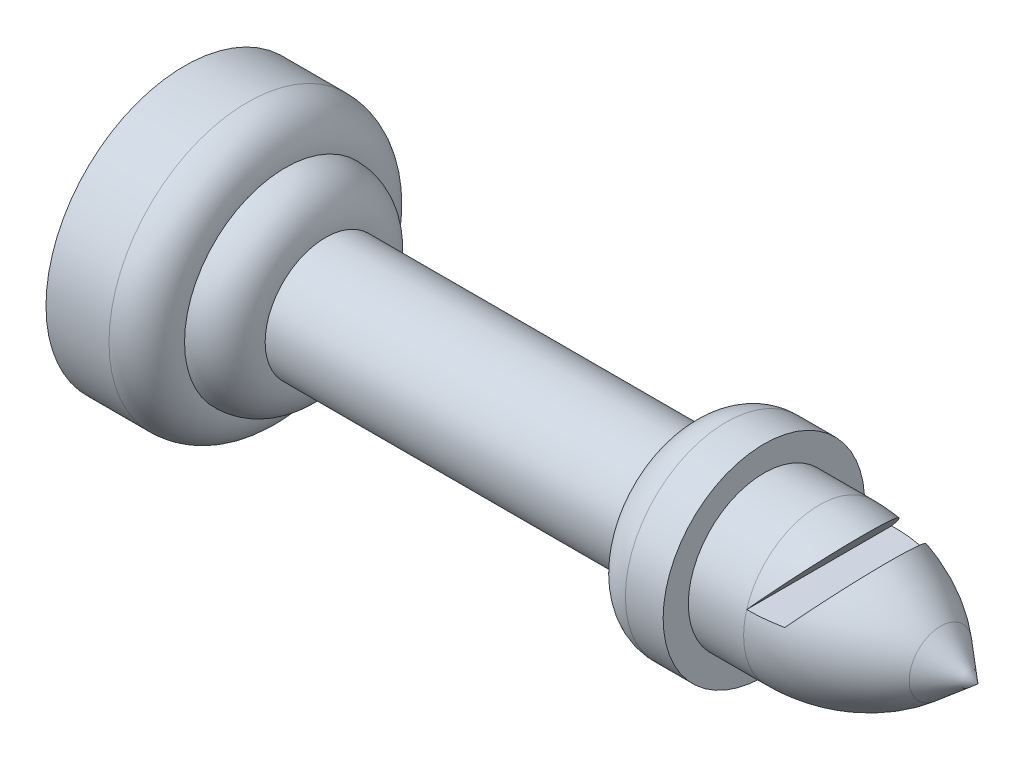
ISO-10303-21;
HEADER;
FILE_DESCRIPTION(('STEP AP214'),'2;1');
FILE_NAME('part.step','',(''),(''),'','','');
FILE_SCHEMA(('AUTOMOTIVE_DESIGN { 1 0 10303 214 1 1 1 1 }'));
ENDSEC;
DATA;
#1=APPLICATION_CONTEXT('core data for automotive mechanical design processes');
#2=APPLICATION_PROTOCOL_DEFINITION('international standard','automotive_design',2000,#1);
#3=PRODUCT_CONTEXT('',#1,'mechanical');
#4=PRODUCT('Part','Part','',(#3));
#5=PRODUCT_RELATED_PRODUCT_CATEGORY('part','',(#4));
#6=PRODUCT_DEFINITION_FORMATION('','',#4);
#7=PRODUCT_DEFINITION_CONTEXT('part definition',#1,'design');
#8=PRODUCT_DEFINITION('design','',#6,#7);
#9=PRODUCT_DEFINITION_SHAPE('','',#8);
#10=(LENGTH_UNIT() NAMED_UNIT(*) SI_UNIT(.MILLI.,.METRE.));
#11=(NAMED_UNIT(*) PLANE_ANGLE_UNIT() SI_UNIT($,.RADIAN.));
#12=(NAMED_UNIT(*) SI_UNIT($,.STERADIAN.) SOLID_ANGLE_UNIT());
#13=UNCERTAINTY_MEASURE_WITH_UNIT(LENGTH_MEASURE(1.E-05),#10,'distance_accuracy_value','');
#14=(GEOMETRIC_REPRESENTATION_CONTEXT(3) GLOBAL_UNCERTAINTY_ASSIGNED_CONTEXT((#13)) GLOBAL_UNIT_ASSIGNED_CONTEXT((#10,
#11,#12)) REPRESENTATION_CONTEXT('',''));
#15=CARTESIAN_POINT('',(0.,0.,0.));
#16=DIRECTION('',(0.,0.,1.));
#17=DIRECTION('',(1.,0.,0.));
#18=AXIS2_PLACEMENT_3D('',#15,#16,#17);
#19=CARTESIAN_POINT('',(50.3899249304417,11.,0.));
#20=DIRECTION('',(-1.,0.,0.));
#21=DIRECTION('',(0.,0.,1.));
#22=AXIS2_PLACEMENT_3D('',#19,#20,#21);
#23=DEGENERATE_TOROIDAL_SURFACE('',#22,9.,15.,.F.);
#24=CARTESIAN_POINT('',(53.0688261314124,12.6068600471893,-5.53012565333859));
#25=CARTESIAN_POINT('',(53.197779841996,12.7540278090024,-5.46299200753165));
#26=CARTESIAN_POINT('',(53.3249850413756,12.8992000913583,-5.38799546765509));
#27=CARTESIAN_POINT('',(53.5750162197194,13.1845468931976,-5.22234542775653));
#28=CARTESIAN_POINT('',(53.6978382569746,13.3247169142258,-5.13167824314576));
#29=CARTESIAN_POINT('',(53.9384835970365,13.5993521761921,-4.93447043976261));
#30=CARTESIAN_POINT('',(54.0562843289732,13.7337916582405,-4.82786623525727));
#31=CARTESIAN_POINT('',(54.2852664886689,13.9951163753426,-4.59926619979012));
#32=CARTESIAN_POINT('',(54.3964467343969,14.1220002614097,-4.47726763235293));
#33=CARTESIAN_POINT('',(54.592925325493,14.3462304473031,-4.24002993247073));
#34=CARTESIAN_POINT('',(54.67943490484,14.4449590617048,-4.12709544007215));
#35=CARTESIAN_POINT('',(54.8462579538327,14.6353450120429,-3.89115113941907));
#36=CARTESIAN_POINT('',(54.9265724676693,14.7270035396569,-3.76814303632989));
#37=CARTESIAN_POINT('',(55.0801538452916,14.902277500356,-3.51256620565445));
#38=CARTESIAN_POINT('',(55.1534269620934,14.9859000696639,-3.38000614710711));
#39=CARTESIAN_POINT('',(55.2921435928217,15.1442097140948,-3.10585419596471));
#40=CARTESIAN_POINT('',(55.3575911121459,15.2189013603574,-2.96426698115663));
#41=CARTESIAN_POINT('',(55.4804066468642,15.3590639603987,-2.67141695851159));
#42=CARTESIAN_POINT('',(55.5376963650972,15.4244455579432,-2.52007832322703));
#43=CARTESIAN_POINT('',(55.642600642106,15.5441670268496,-2.20995067487123));
#44=CARTESIAN_POINT('',(55.6902204524076,15.5985128914885,-2.05116576370601));
#45=CARTESIAN_POINT('',(55.7749577509117,15.6952188994544,-1.72753410959527));
#46=CARTESIAN_POINT('',(55.8120913186326,15.7375973934495,-1.56269709038728));
#47=CARTESIAN_POINT('',(55.8752475291283,15.8096740952458,-1.22827483179028));
#48=CARTESIAN_POINT('',(55.9012762843317,15.8393792788246,-1.05869225942007));
#49=CARTESIAN_POINT('',(55.9417136985954,15.8855282707672,-0.716511047153845));
#50=CARTESIAN_POINT('',(55.9561324797353,15.9019836309025,-0.543915168834099));
#51=CARTESIAN_POINT('',(55.9730822021221,15.9213274147745,-0.197383085149083));
#52=CARTESIAN_POINT('',(55.9756139523859,15.9242167617976,-0.023446971805672));
#53=CARTESIAN_POINT('',(55.9691595198293,15.9168506736964,0.302765420454932));
#54=CARTESIAN_POINT('',(55.9615343520461,15.9081484900135,0.455107643948066));
#55=CARTESIAN_POINT('',(55.9371955240737,15.8803719272326,0.758168934683142));
#56=CARTESIAN_POINT('',(55.9204786055681,15.8612938295979,0.908887400239774));
#57=CARTESIAN_POINT('',(55.8781973830614,15.8130406009403,1.20760109726925));
#58=CARTESIAN_POINT('',(55.8526234948177,15.7838545319497,1.3555931950426));
#59=CARTESIAN_POINT('',(55.7930088043809,15.715819571784,1.64765271280331));
#60=CARTESIAN_POINT('',(55.758964640074,15.6769668436139,1.79171854908133));
#61=CARTESIAN_POINT('',(55.6851475719756,15.5927234926744,2.06651225599645));
#62=CARTESIAN_POINT('',(55.6458334673826,15.5478564721408,2.19752470355436));
#63=CARTESIAN_POINT('',(55.5605892094678,15.4505718993437,2.45451466199021));
#64=CARTESIAN_POINT('',(55.5146568852803,15.3981518695907,2.58049050340438));
#65=CARTESIAN_POINT('',(55.3677149912479,15.2304551855367,2.94975688510388));
#66=CARTESIAN_POINT('',(55.2574668912873,15.104635106053,3.18472915253418));
#67=CARTESIAN_POINT('',(55.0030639760674,14.8142990818922,3.65312990503934));
#68=CARTESIAN_POINT('',(54.8565109101178,14.6470461458965,3.88353148567212));
#69=CARTESIAN_POINT('',(54.5428242895247,14.2890528965788,4.30990137590636));
#70=CARTESIAN_POINT('',(54.3756630686379,14.0982810092984,4.50582252071206));
#71=CARTESIAN_POINT('',(54.0249726320784,13.6980573445109,4.86183244871354));
#72=CARTESIAN_POINT('',(53.8413999991939,13.4885560173333,5.02182200090159));
#73=CARTESIAN_POINT('',(53.4628231097641,13.0565070810181,5.30410564780449));
#74=CARTESIAN_POINT('',(53.2678601523645,12.8340066043191,5.42652695079986));
#75=CARTESIAN_POINT('',(53.0688261314124,12.6068600471893,5.53012565333859));
#76=B_SPLINE_CURVE_WITH_KNOTS('',3,(#24,#25,#26,#27,#28,#29,#30,#31,#32,#33,#34,#35,#36,#37,#38,
#39,#40,#41,#42,#43,#44,#45,#46,#47,#48,#49,#50,#51,#52,#53,#54,#55,#56,#57,#58,#59,#60,#61,#62,
#63,#64,#65,#66,#67,#68,#69,#70,#71,#72,#73,#74,#75),.UNSPECIFIED.,.F.,.F.,(4,2,2,2,2,2,2,2,2,2,
2,2,2,2,2,2,2,2,2,2,2,2,2,2,2,4),(0.,0.620502170800822,1.24154896630845,1.86514323455668,
2.48884850841412,3.00782711146784,3.52671804760373,4.04514384703762,4.56330315285486,
5.08614158216545,5.60869530491601,6.13044334235936,6.65190382204348,7.1729091760678,
7.69387907057977,8.15160079284239,8.60948666235488,9.06786957235137,9.52643471974564,
9.95783658896935,10.3893802873669,11.2513660736983,12.2083954832962,13.1667239796494,
14.1276673748359,15.0853201134679),.UNSPECIFIED.);
#77=CARTESIAN_POINT('',(53.1404754237636,12.6886294351589,-5.49191523058684));
#78=VERTEX_POINT('',#77);
#79=CARTESIAN_POINT('',(53.1404754237636,12.6886294351589,5.49191523058684));
#80=VERTEX_POINT('',#79);
#81=EDGE_CURVE('E100',#78,#80,#76,.T.);
#82=ORIENTED_EDGE('',*,*,#81,.T.);
#83=CARTESIAN_POINT('',(59.7410941995924,12.6886294351589,2.14307238397965));
#84=CARTESIAN_POINT('',(59.6918956159423,12.6886294351589,2.19300718822318));
#85=CARTESIAN_POINT('',(59.6420500558606,12.6886294351589,2.24229743952765));
#86=CARTESIAN_POINT('',(59.5411742713549,12.6886294351589,2.339642584806));
#87=CARTESIAN_POINT('',(59.4901441458257,12.6886294351589,2.38769758120562));
#88=CARTESIAN_POINT('',(59.3354706448059,12.6886294351589,2.53006368376872));
#89=CARTESIAN_POINT('',(59.2302036508667,12.6886294351589,2.62261673280479));
#90=CARTESIAN_POINT('',(59.0161205373442,12.6886294351589,2.80318907820046));
#91=CARTESIAN_POINT('',(58.9073096634447,12.6886294351589,2.8912146188333));
#92=CARTESIAN_POINT('',(58.6864161832837,12.6886294351589,3.06307237778934));
#93=CARTESIAN_POINT('',(58.5743331989777,12.6886294351589,3.14690410851863));
#94=CARTESIAN_POINT('',(58.2341864979827,12.6886294351589,3.39194233869002));
#95=CARTESIAN_POINT('',(58.0017323792394,12.6886294351589,3.54710323608377));
#96=CARTESIAN_POINT('',(57.5270020897726,12.6886294351589,3.84178596942499));
#97=CARTESIAN_POINT('',(57.2847201067934,12.6886294351589,3.98129836158695));
#98=CARTESIAN_POINT('',(56.6955363197894,12.6886294351589,4.29621202569859));
#99=CARTESIAN_POINT('',(56.3447267491199,12.6886294351589,4.46435307865889));
#100=CARTESIAN_POINT('',(55.630192973998,12.6886294351589,4.77036814928859));
#101=CARTESIAN_POINT('',(55.2664680703092,12.6886294351589,4.90824052529983));
#102=CARTESIAN_POINT('',(54.528078907649,12.6886294351589,5.15364615028319));
#103=CARTESIAN_POINT('',(54.1533933211201,12.6886294351589,5.26111521393694));
#104=CARTESIAN_POINT('',(53.3964866800814,12.6886294351589,5.44496361432838));
#105=CARTESIAN_POINT('',(53.0142657012473,12.6886294351589,5.52134326312161));
#106=CARTESIAN_POINT('',(52.2421790096399,12.6886294351589,5.64314747747477));
#107=CARTESIAN_POINT('',(51.8522784982744,12.6886294351589,5.68835141522395));
#108=CARTESIAN_POINT('',(51.0700871782298,12.6886294351589,5.74674778950862));
#109=CARTESIAN_POINT('',(50.6777963528164,12.6886294351589,5.75994000167581));
#110=CARTESIAN_POINT('',(49.8939111517407,12.6886294351589,5.75425965018309));
#111=CARTESIAN_POINT('',(49.5023165003827,12.6886294351589,5.73542488911303));
#112=CARTESIAN_POINT('',(48.7219731847928,12.6886294351589,5.6658426745292));
#113=CARTESIAN_POINT('',(48.3332244604778,12.6886294351589,5.61509589671876));
#114=CARTESIAN_POINT('',(47.5854895221479,12.6886294351589,5.4860938624354));
#115=CARTESIAN_POINT('',(47.226169202273,12.6886294351589,5.40976949911571));
#116=CARTESIAN_POINT('',(46.5145183265015,12.6886294351589,5.22954742598611));
#117=CARTESIAN_POINT('',(46.162187637063,12.6886294351589,5.12565024352118));
#118=CARTESIAN_POINT('',(45.4661237116663,12.6886294351589,4.89037024235336));
#119=CARTESIAN_POINT('',(45.1224055124068,12.6886294351589,4.75894265658034));
#120=CARTESIAN_POINT('',(44.6155804697985,12.6886294351589,4.54151080186105));
#121=CARTESIAN_POINT('',(44.448068132847,12.6886294351589,4.46563628527528));
#122=CARTESIAN_POINT('',(44.1162185610138,12.6886294351589,4.30710499560139));
#123=CARTESIAN_POINT('',(43.9518823694679,12.6886294351589,4.22444603914182));
#124=CARTESIAN_POINT('',(43.7893061546129,12.6886294351589,4.1384080791379));
#125=B_SPLINE_CURVE_WITH_KNOTS('',3,(#83,#84,#85,#86,#87,#88,#89,#90,#91,#92,#93,#94,#95,#96,
#97,#98,#99,#100,#101,#102,#103,#104,#105,#106,#107,#108,#109,#110,#111,#112,#113,#114,#115,
#116,#117,#118,#119,#120,#121,#122,#123,#124),.UNSPECIFIED.,.F.,.F.,(4,2,2,2,2,2,2,2,2,2,2,2,2,
2,2,2,2,2,2,2,4),(0.,0.21028507697573,0.420552660767613,0.840915486506825,1.26068208909176,
1.68049738301398,2.5182071102555,3.35641970104828,4.52196058312432,5.68756466410649,
6.85561142917855,8.02364646985966,9.19986503670883,10.376091847581,11.5509312791007,
12.7257458354713,13.8266702831026,14.9275736764796,16.0302813375091,16.581833772903,
17.1335644103998),.UNSPECIFIED.);
#126=CARTESIAN_POINT('',(50.3899249304417,12.6886294351589,5.75747606427635));
#127=VERTEX_POINT('',#126);
#128=EDGE_CURVE('E88',#80,#127,#125,.T.);
#129=ORIENTED_EDGE('',*,*,#128,.T.);
#130=CARTESIAN_POINT('',(50.3899249304417,11.,0.));
#131=DIRECTION('',(-1.,0.,0.));
#132=DIRECTION('',(0.,0.,1.));
#133=AXIS2_PLACEMENT_3D('',#130,#131,#132);
#134=CIRCLE('',#133,6.);
#135=CARTESIAN_POINT('',(50.3899249304417,12.6886294351589,-5.75747606427635));
#136=VERTEX_POINT('',#135);
#137=EDGE_CURVE('E103',#136,#127,#134,.T.);
#138=ORIENTED_EDGE('',*,*,#137,.F.);
#139=CARTESIAN_POINT('',(59.7410941995924,12.6886294351589,-2.14307238397961));
#140=CARTESIAN_POINT('',(59.6918956159424,12.6886294351589,-2.19300718822314));
#141=CARTESIAN_POINT('',(59.6420500558606,12.6886294351589,-2.24229743952761));
#142=CARTESIAN_POINT('',(59.541174271355,12.6886294351589,-2.33964258480596));
#143=CARTESIAN_POINT('',(59.4901441458257,12.6886294351589,-2.38769758120558));
#144=CARTESIAN_POINT('',(59.335470644806,12.6886294351589,-2.53006368376867));
#145=CARTESIAN_POINT('',(59.2302036508668,12.6886294351589,-2.62261673280475));
#146=CARTESIAN_POINT('',(59.0161205373442,12.6886294351589,-2.80318907820041));
#147=CARTESIAN_POINT('',(58.9073096634448,12.6886294351589,-2.89121461883326));
#148=CARTESIAN_POINT('',(58.6864161832838,12.6886294351589,-3.06307237778929));
#149=CARTESIAN_POINT('',(58.5743331989777,12.6886294351589,-3.14690410851858));
#150=CARTESIAN_POINT('',(58.2341864979828,12.6886294351589,-3.39194233868997));
#151=CARTESIAN_POINT('',(58.0017323792395,12.6886294351589,-3.54710323608372));
#152=CARTESIAN_POINT('',(57.5270020897727,12.6886294351589,-3.84178596942494));
#153=CARTESIAN_POINT('',(57.2847201067935,12.6886294351589,-3.9812983615869));
#154=CARTESIAN_POINT('',(56.6955363197895,12.6886294351589,-4.29621202569855));
#155=CARTESIAN_POINT('',(56.34472674912,12.6886294351589,-4.46435307865885));
#156=CARTESIAN_POINT('',(55.6301929739981,12.6886294351589,-4.77036814928855));
#157=CARTESIAN_POINT('',(55.2664680703093,12.6886294351589,-4.90824052529979));
#158=CARTESIAN_POINT('',(54.5280789076491,12.6886294351589,-5.15364615028315));
#159=CARTESIAN_POINT('',(54.1533933211202,12.6886294351589,-5.26111521393691));
#160=CARTESIAN_POINT('',(53.3964866800815,12.6886294351589,-5.44496361432835));
#161=CARTESIAN_POINT('',(53.0142657012474,12.6886294351589,-5.52134326312159));
#162=CARTESIAN_POINT('',(52.24217900964,12.6886294351589,-5.64314747747476));
#163=CARTESIAN_POINT('',(51.8522784982745,12.6886294351589,-5.68835141522394));
#164=CARTESIAN_POINT('',(51.0700871782299,12.6886294351589,-5.74674778950861));
#165=CARTESIAN_POINT('',(50.6777963528165,12.6886294351589,-5.75994000167581));
#166=CARTESIAN_POINT('',(49.8939111517408,12.6886294351589,-5.7542596501831));
#167=CARTESIAN_POINT('',(49.5023165003828,12.6886294351589,-5.73542488911303));
#168=CARTESIAN_POINT('',(48.721973184793,12.6886294351589,-5.66584267452921));
#169=CARTESIAN_POINT('',(48.333224460478,12.6886294351589,-5.61509589671878));
#170=CARTESIAN_POINT('',(47.585489522148,12.6886294351589,-5.48609386243543));
#171=CARTESIAN_POINT('',(47.2261692022731,12.6886294351589,-5.40976949911573));
#172=CARTESIAN_POINT('',(46.5145183265016,12.6886294351589,-5.22954742598613));
#173=CARTESIAN_POINT('',(46.162187637063,12.6886294351589,-5.1256502435212));
#174=CARTESIAN_POINT('',(45.4661237116664,12.6886294351589,-4.89037024235338));
#175=CARTESIAN_POINT('',(45.1224055124068,12.6886294351589,-4.75894265658037));
#176=CARTESIAN_POINT('',(44.6155804697985,12.6886294351589,-4.54151080186107));
#177=CARTESIAN_POINT('',(44.4480681328471,12.6886294351589,-4.46563628527529));
#178=CARTESIAN_POINT('',(44.1162185610138,12.6886294351589,-4.3071049956014));
#179=CARTESIAN_POINT('',(43.9518823694679,12.6886294351589,-4.22444603914182));
#180=CARTESIAN_POINT('',(43.7893061546129,12.6886294351589,-4.13840807913791));
#181=B_SPLINE_CURVE_WITH_KNOTS('',3,(#139,#140,#141,#142,#143,#144,#145,#146,#147,#148,#149,
#150,#151,#152,#153,#154,#155,#156,#157,#158,#159,#160,#161,#162,#163,#164,#165,#166,#167,#168,
#169,#170,#171,#172,#173,#174,#175,#176,#177,#178,#179,#180),.UNSPECIFIED.,.F.,.F.,(4,2,2,2,2,2,
2,2,2,2,2,2,2,2,2,2,2,2,2,2,4),(0.,0.210285076975723,0.420552660767611,0.84091548650681,
1.26068208909175,1.68049738301396,2.51820711025547,3.35641970104824,4.52196058312427,
5.68756466410644,6.85561142917849,8.02364646985961,9.19986503670877,10.3760918475809,
11.5509312791007,12.7257458354712,13.8266702831025,14.9275736764796,16.0302813375091,
16.581833772903,17.1335644103999),.UNSPECIFIED.);
#182=EDGE_CURVE('E11',#78,#136,#181,.T.);
#183=ORIENTED_EDGE('',*,*,#182,.F.);
#184=EDGE_LOOP('',(#82,#129,#138,#183));
#185=FACE_BOUND('',#184,.T.);
#186=CARTESIAN_POINT('',(60.0317390757398,11.,0.));
#187=DIRECTION('',(-1.,0.,0.));
#188=DIRECTION('',(0.,0.,1.));
#189=AXIS2_PLACEMENT_3D('',#186,#187,#188);
#190=CIRCLE('',#189,2.49066664678466);
#191=CARTESIAN_POINT('',(60.0317390757398,11.,2.49066664678466));
#192=VERTEX_POINT('',#191);
#193=EDGE_CURVE('E110',#192,#192,#190,.T.);
#194=ORIENTED_EDGE('',*,*,#193,.T.);
#195=EDGE_LOOP('',(#194));
#196=FACE_BOUND('',#195,.T.);
#197=ADVANCED_FACE('F47',(#185,#196),#23,.F.);
#198=CARTESIAN_POINT('',(43.,11.,0.));
#199=DIRECTION('',(-1.,0.,0.));
#200=DIRECTION('',(0.,0.,1.));
#201=AXIS2_PLACEMENT_3D('',#198,#199,#200);
#202=TOROIDAL_SURFACE('',#201,4.8,3.2);
#203=CARTESIAN_POINT('',(39.8,11.,0.));
#204=DIRECTION('',(-1.,0.,0.));
#205=DIRECTION('',(0.,0.,1.));
#206=AXIS2_PLACEMENT_3D('',#203,#204,#205);
#207=CIRCLE('',#206,4.8);
#208=CARTESIAN_POINT('',(39.8,11.,4.8));
#209=VERTEX_POINT('',#208);
#210=EDGE_CURVE('E93',#209,#209,#207,.T.);
#211=ORIENTED_EDGE('',*,*,#210,.F.);
#212=EDGE_LOOP('',(#211));
#213=FACE_BOUND('',#212,.T.);
#214=CARTESIAN_POINT('',(43.,11.,0.));
#215=DIRECTION('',(-1.,0.,0.));
#216=DIRECTION('',(0.,0.,1.));
#217=AXIS2_PLACEMENT_3D('',#214,#215,#216);
#218=CIRCLE('',#217,8.);
#219=CARTESIAN_POINT('',(43.,11.,8.));
#220=VERTEX_POINT('',#219);
#221=EDGE_CURVE('E126',#220,#220,#218,.T.);
#222=ORIENTED_EDGE('',*,*,#221,.T.);
#223=EDGE_LOOP('',(#222));
#224=FACE_BOUND('',#223,.T.);
#225=ADVANCED_FACE('F49',(#213,#224),#202,.T.);
#226=CARTESIAN_POINT('',(0.,11.,0.));
#227=DIRECTION('',(-1.,0.,0.));
#228=DIRECTION('',(0.,0.,1.));
#229=AXIS2_PLACEMENT_3D('',#226,#227,#228);
#230=CYLINDRICAL_SURFACE('',#229,8.);
#231=CARTESIAN_POINT('',(46.,11.,0.));
#232=DIRECTION('',(-1.,0.,0.));
#233=DIRECTION('',(0.,0.,1.));
#234=AXIS2_PLACEMENT_3D('',#231,#232,#233);
#235=CIRCLE('',#234,8.);
#236=CARTESIAN_POINT('',(46.,11.,8.));
#237=VERTEX_POINT('',#236);
#238=EDGE_CURVE('E118',#237,#237,#235,.T.);
#239=ORIENTED_EDGE('',*,*,#238,.T.);
#240=EDGE_LOOP('',(#239));
#241=FACE_BOUND('',#240,.T.);
#242=ORIENTED_EDGE('',*,*,#221,.F.);
#243=EDGE_LOOP('',(#242));
#244=FACE_BOUND('',#243,.T.);
#245=ADVANCED_FACE('F185',(#241,#244),#230,.T.);
#246=CARTESIAN_POINT('',(46.,0.,0.));
#247=DIRECTION('',(1.,0.,0.));
#248=DIRECTION('',(0.,0.,-1.));
#249=AXIS2_PLACEMENT_3D('',#246,#247,#248);
#250=PLANE('',#249);
#251=CARTESIAN_POINT('',(46.,11.,0.));
#252=DIRECTION('',(-1.,0.,0.));
#253=DIRECTION('',(0.,0.,1.));
#254=AXIS2_PLACEMENT_3D('',#251,#252,#253);
#255=CIRCLE('',#254,6.);
#256=CARTESIAN_POINT('',(46.,11.,6.));
#257=VERTEX_POINT('',#256);
#258=EDGE_CURVE('E115',#257,#257,#255,.T.);
#259=ORIENTED_EDGE('',*,*,#258,.T.);
#260=EDGE_LOOP('',(#259));
#261=FACE_BOUND('',#260,.T.);
#262=ORIENTED_EDGE('',*,*,#238,.F.);
#263=EDGE_LOOP('',(#262));
#264=FACE_BOUND('',#263,.T.);
#265=ADVANCED_FACE('F190',(#261,#264),#250,.T.);
#266=CARTESIAN_POINT('',(0.,11.,0.));
#267=DIRECTION('',(-1.,0.,0.));
#268=DIRECTION('',(0.,0.,1.));
#269=AXIS2_PLACEMENT_3D('',#266,#267,#268);
#270=CYLINDRICAL_SURFACE('',#269,6.);
#271=ORIENTED_EDGE('',*,*,#137,.T.);
#272=EDGE_CURVE('E71',#127,#136,#134,.T.);
#273=ORIENTED_EDGE('',*,*,#272,.T.);
#274=EDGE_LOOP('',(#271,#273));
#275=FACE_BOUND('',#274,.T.);
#276=ORIENTED_EDGE('',*,*,#258,.F.);
#277=EDGE_LOOP('',(#276));
#278=FACE_BOUND('',#277,.T.);
#279=ADVANCED_FACE('F112',(#275,#278),#270,.T.);
#280=ORIENTED_EDGE('',*,*,#272,.F.);
#281=CARTESIAN_POINT('',(50.2953052163719,12.5806451710378,5.78774392493274));
#282=CARTESIAN_POINT('',(50.4293472695136,12.7336199777372,5.74684613759314));
#283=CARTESIAN_POINT('',(50.5623423347454,12.8853999148461,5.69789932720466));
#284=CARTESIAN_POINT('',(50.8253735390157,13.1855829296991,5.5839144012936));
#285=CARTESIAN_POINT('',(50.9554081262384,13.3339842364411,5.51886804958245));
#286=CARTESIAN_POINT('',(51.2123681799172,13.6272385817728,5.37224542978904));
#287=CARTESIAN_POINT('',(51.3392671239511,13.7720613517838,5.29056180265103));
#288=CARTESIAN_POINT('',(51.5879983019549,14.0559245348925,5.11105231870086));
#289=CARTESIAN_POINT('',(51.7098311186785,14.194965613055,5.0132283249729));
#290=CARTESIAN_POINT('',(51.9477830443599,14.4665270296529,4.80121963770974));
#291=CARTESIAN_POINT('',(52.063878913582,14.599020845859,4.68697473135996));
#292=CARTESIAN_POINT('',(52.2885836526614,14.8554639785882,4.44278852240863));
#293=CARTESIAN_POINT('',(52.3971968297854,14.9794182107573,4.31285637046289));
#294=CARTESIAN_POINT('',(52.6055259818934,15.217172788717,4.03797388853093));
#295=CARTESIAN_POINT('',(52.705256832148,15.3309901108341,3.89304958084606));
#296=CARTESIAN_POINT('',(52.8946315974361,15.5471130919037,3.58874935345403));
#297=CARTESIAN_POINT('',(52.9842776641231,15.64942120642,3.42937652958515));
#298=CARTESIAN_POINT('',(53.1422606274735,15.8297184542902,3.11661652583141));
#299=CARTESIAN_POINT('',(53.2118634151469,15.9091522792766,2.96470056123582));
#300=CARTESIAN_POINT('',(53.3410804856353,16.0566205992323,2.65139836397));
#301=CARTESIAN_POINT('',(53.4006970347046,16.1246576805527,2.49001429122617));
#302=CARTESIAN_POINT('',(53.5088820787725,16.248123308064,2.15932133029911));
#303=CARTESIAN_POINT('',(53.5574727757029,16.3035771920959,1.99002921046404));
#304=CARTESIAN_POINT('',(53.6428670718682,16.4010329952781,1.64482160331609));
#305=CARTESIAN_POINT('',(53.6796771746811,16.4430423366036,1.46890983059665));
#306=CARTESIAN_POINT('',(53.7421704713818,16.514362491426,1.10431071341794));
#307=CARTESIAN_POINT('',(53.7672943109464,16.5430349446664,0.91540152954809));
#308=CARTESIAN_POINT('',(53.8033725011515,16.5842089944763,0.534488717041966));
#309=CARTESIAN_POINT('',(53.8143287507273,16.5967127581963,0.342485506603259));
#310=CARTESIAN_POINT('',(53.8209265774012,16.6042424940994,0.00412333402962834));
#311=CARTESIAN_POINT('',(53.8196157492569,16.6027465181926,-0.142116251629624));
#312=CARTESIAN_POINT('',(53.8087012076435,16.5902903534712,-0.433927137241937));
#313=CARTESIAN_POINT('',(53.7990955264028,16.5793279189474,-0.579498270380868));
#314=CARTESIAN_POINT('',(53.7717066694889,16.5480705262567,-0.868961990693927));
#315=CARTESIAN_POINT('',(53.753917435284,16.5277686538216,-1.01285325314135));
#316=CARTESIAN_POINT('',(53.7103883159957,16.4780912693527,-1.29789092597789));
#317=CARTESIAN_POINT('',(53.6846453965211,16.4487122943355,-1.43903626689447));
#318=CARTESIAN_POINT('',(53.6256353815399,16.3813674169369,-1.71711412968049));
#319=CARTESIAN_POINT('',(53.5923948447632,16.3434318245701,-1.8540596291761));
#320=CARTESIAN_POINT('',(53.51873364844,16.2593663614957,-2.12344870996809));
#321=CARTESIAN_POINT('',(53.4783103784152,16.2132335115934,-2.2558906335742));
#322=CARTESIAN_POINT('',(53.3469431700033,16.0633113577435,-2.64522755171428));
#323=CARTESIAN_POINT('',(53.2458443029104,15.9479327934157,-2.89440029892156));
#324=CARTESIAN_POINT('',(53.0129457182834,15.6821384764172,-3.3831254511046));
#325=CARTESIAN_POINT('',(52.8795326178639,15.529881458791,-3.62088885378019));
#326=CARTESIAN_POINT('',(52.5910785499835,15.2006847310372,-4.06400603981809));
#327=CARTESIAN_POINT('',(52.4360265136894,15.0237323886604,-4.26934312103058));
#328=CARTESIAN_POINT('',(52.0870532718654,14.6254684635707,-4.67042297585278));
#329=CARTESIAN_POINT('',(51.8907040467309,14.4013859159186,-4.86128917962414));
#330=CARTESIAN_POINT('',(51.4817032028632,13.9346157974066,-5.19724443344277));
#331=CARTESIAN_POINT('',(51.2690492570352,13.6919255707618,-5.34232693382761));
#332=CARTESIAN_POINT('',(50.9278142727489,13.3024928924583,-5.53293806177691));
#333=CARTESIAN_POINT('',(50.8029593937462,13.1600029011963,-5.59430392027455));
#334=CARTESIAN_POINT('',(50.550833712185,12.8722657582863,-5.70211425567124));
#335=CARTESIAN_POINT('',(50.4235701204618,12.7270268359674,-5.74859751973325));
#336=CARTESIAN_POINT('',(50.2953052163719,12.5806451710378,-5.78774392493274));
#337=B_SPLINE_CURVE_WITH_KNOTS('',3,(#281,#282,#283,#284,#285,#286,#287,#288,#289,#290,#291,
#292,#293,#294,#295,#296,#297,#298,#299,#300,#301,#302,#303,#304,#305,#306,#307,#308,#309,#310,
#311,#312,#313,#314,#315,#316,#317,#318,#319,#320,#321,#322,#323,#324,#325,#326,#327,#328,#329,
#330,#331,#332,#333,#334,#335,#336),.UNSPECIFIED.,.F.,.F.,(4,2,2,2,2,2,2,2,2,2,2,2,2,2,2,2,2,2,
2,2,2,2,2,2,2,2,2,4),(0.,0.622273547287704,1.24486609708476,1.87161127376612,2.49828415573491,
3.1273165195405,3.75598371418263,4.38357746211704,5.011037053899,5.56528700987792,
6.11941101472516,6.6724091193832,7.22510140795637,7.80205466405445,8.37893058091535,
8.81717531450056,9.25552404058526,9.69419781303966,10.133039149943,10.5703497392217,
11.0078195900792,11.8819272706043,12.8151247819503,13.7488014078065,14.8061956557647,
15.8637411024816,16.460642817982,17.0559759743814),.UNSPECIFIED.);
#338=EDGE_CURVE('E62',#127,#136,#337,.T.);
#339=ORIENTED_EDGE('',*,*,#338,.T.);
#340=EDGE_LOOP('',(#280,#339));
#341=FACE_BOUND('',#340,.T.);
#342=ADVANCED_FACE('F108',(#341),#23,.F.);
#343=CARTESIAN_POINT('',(60.0317390757398,11.,0.));
#344=DIRECTION('',(-1.,0.,0.));
#345=DIRECTION('',(0.,0.,1.));
#346=AXIS2_PLACEMENT_3D('',#343,#344,#345);
#347=CONICAL_SURFACE('',#346,2.49066664678466,0.698131700797734);
#348=CARTESIAN_POINT('',(63.,11.,0.));
#349=VERTEX_POINT('',#348);
#350=VERTEX_LOOP('',#349);
#351=FACE_BOUND('',#350,.T.);
#352=ORIENTED_EDGE('',*,*,#193,.F.);
#353=EDGE_LOOP('',(#352));
#354=FACE_BOUND('',#353,.T.);
#355=ADVANCED_FACE('F172',(#351,#354),#347,.T.);
#356=CARTESIAN_POINT('',(0.,0.,0.));
#357=DIRECTION('',(1.,0.,0.));
#358=DIRECTION('',(0.,0.,-1.));
#359=AXIS2_PLACEMENT_3D('',#356,#357,#358);
#360=PLANE('',#359);
#361=CARTESIAN_POINT('',(0.,11.,0.));
#362=DIRECTION('',(-1.,0.,0.));
#363=DIRECTION('',(0.,0.,1.));
#364=AXIS2_PLACEMENT_3D('',#361,#362,#363);
#365=CIRCLE('',#364,10.);
#366=CARTESIAN_POINT('',(0.,11.,10.));
#367=VERTEX_POINT('',#366);
#368=EDGE_CURVE('E231',#367,#367,#365,.T.);
#369=ORIENTED_EDGE('',*,*,#368,.F.);
#370=EDGE_LOOP('',(#369));
#371=FACE_BOUND('',#370,.T.);
#372=CARTESIAN_POINT('',(0.,11.,0.));
#373=DIRECTION('',(-1.,0.,0.));
#374=DIRECTION('',(0.,0.,1.));
#375=AXIS2_PLACEMENT_3D('',#372,#373,#374);
#376=CIRCLE('',#375,11.);
#377=CARTESIAN_POINT('',(0.,11.,11.));
#378=VERTEX_POINT('',#377);
#379=EDGE_CURVE('E212',#378,#378,#376,.T.);
#380=ORIENTED_EDGE('',*,*,#379,.T.);
#381=EDGE_LOOP('',(#380));
#382=FACE_BOUND('',#381,.T.);
#383=ADVANCED_FACE('F169',(#371,#382),#360,.F.);
#384=CARTESIAN_POINT('',(0.,11.,0.));
#385=DIRECTION('',(-1.,0.,0.));
#386=DIRECTION('',(0.,0.,1.));
#387=AXIS2_PLACEMENT_3D('',#384,#385,#386);
#388=CYLINDRICAL_SURFACE('',#387,11.);
#389=CARTESIAN_POINT('',(5.,11.,0.));
#390=DIRECTION('',(-1.,0.,0.));
#391=DIRECTION('',(0.,0.,1.));
#392=AXIS2_PLACEMENT_3D('',#389,#390,#391);
#393=CIRCLE('',#392,11.);
#394=CARTESIAN_POINT('',(5.,11.,11.));
#395=VERTEX_POINT('',#394);
#396=EDGE_CURVE('E209',#395,#395,#393,.T.);
#397=ORIENTED_EDGE('',*,*,#396,.T.);
#398=EDGE_LOOP('',(#397));
#399=FACE_BOUND('',#398,.T.);
#400=ORIENTED_EDGE('',*,*,#379,.F.);
#401=EDGE_LOOP('',(#400));
#402=FACE_BOUND('',#401,.T.);
#403=ADVANCED_FACE('F165',(#399,#402),#388,.T.);
#404=CARTESIAN_POINT('',(5.,11.,0.));
#405=DIRECTION('',(-1.,0.,0.));
#406=DIRECTION('',(0.,0.,1.));
#407=AXIS2_PLACEMENT_3D('',#404,#405,#406);
#408=TOROIDAL_SURFACE('',#407,8.,3.);
#409=CARTESIAN_POINT('',(8.,11.,0.));
#410=DIRECTION('',(-1.,0.,0.));
#411=DIRECTION('',(0.,0.,1.));
#412=AXIS2_PLACEMENT_3D('',#409,#410,#411);
#413=CIRCLE('',#412,8.);
#414=CARTESIAN_POINT('',(8.,11.,8.));
#415=VERTEX_POINT('',#414);
#416=EDGE_CURVE('E202',#415,#415,#413,.T.);
#417=ORIENTED_EDGE('',*,*,#416,.T.);
#418=EDGE_LOOP('',(#417));
#419=FACE_BOUND('',#418,.T.);
#420=ORIENTED_EDGE('',*,*,#396,.F.);
#421=EDGE_LOOP('',(#420));
#422=FACE_BOUND('',#421,.T.);
#423=ADVANCED_FACE('F161',(#419,#422),#408,.T.);
#424=CARTESIAN_POINT('',(8.,11.,0.));
#425=DIRECTION('',(-1.,0.,0.));
#426=DIRECTION('',(0.,0.,1.));
#427=AXIS2_PLACEMENT_3D('',#424,#425,#426);
#428=TOROIDAL_SURFACE('',#427,4.8,3.2);
#429=CARTESIAN_POINT('',(11.2,11.,0.));
#430=DIRECTION('',(-1.,0.,0.));
#431=DIRECTION('',(0.,0.,1.));
#432=AXIS2_PLACEMENT_3D('',#429,#430,#431);
#433=CIRCLE('',#432,4.8);
#434=CARTESIAN_POINT('',(11.2,11.,4.8));
#435=VERTEX_POINT('',#434);
#436=EDGE_CURVE('E198',#435,#435,#433,.T.);
#437=ORIENTED_EDGE('',*,*,#436,.T.);
#438=EDGE_LOOP('',(#437));
#439=FACE_BOUND('',#438,.T.);
#440=ORIENTED_EDGE('',*,*,#416,.F.);
#441=EDGE_LOOP('',(#440));
#442=FACE_BOUND('',#441,.T.);
#443=ADVANCED_FACE('F157',(#439,#442),#428,.T.);
#444=CARTESIAN_POINT('',(0.,11.,0.));
#445=DIRECTION('',(-1.,0.,0.));
#446=DIRECTION('',(0.,0.,1.));
#447=AXIS2_PLACEMENT_3D('',#444,#445,#446);
#448=CYLINDRICAL_SURFACE('',#447,4.8);
#449=ORIENTED_EDGE('',*,*,#210,.T.);
#450=EDGE_LOOP('',(#449));
#451=FACE_BOUND('',#450,.T.);
#452=ORIENTED_EDGE('',*,*,#436,.F.);
#453=EDGE_LOOP('',(#452));
#454=FACE_BOUND('',#453,.T.);
#455=ADVANCED_FACE('F154',(#451,#454),#448,.T.);
#456=CARTESIAN_POINT('',(50.3899249304417,12.6886294351589,-10.));
#457=DIRECTION('',(0.,-1.,0.));
#458=DIRECTION('',(0.,0.,-1.));
#459=AXIS2_PLACEMENT_3D('',#456,#457,#458);
#460=PLANE('',#459);
#461=ORIENTED_EDGE('',*,*,#182,.T.);
#462=DIRECTION('',(0.,0.,1.));
#463=VECTOR('',#462,1.);
#464=CARTESIAN_POINT('',(50.3899249304417,12.6886294351589,-10.));
#465=LINE('',#464,#463);
#466=EDGE_CURVE('E83',#136,#127,#465,.T.);
#467=ORIENTED_EDGE('',*,*,#466,.T.);
#468=ORIENTED_EDGE('',*,*,#128,.F.);
#469=DIRECTION('',(0.,0.,1.));
#470=VECTOR('',#469,1.);
#471=CARTESIAN_POINT('',(53.1404754237636,12.6886294351589,-10.));
#472=LINE('',#471,#470);
#473=EDGE_CURVE('E94',#78,#80,#472,.T.);
#474=ORIENTED_EDGE('',*,*,#473,.F.);
#475=EDGE_LOOP('',(#461,#467,#468,#474));
#476=FACE_BOUND('',#475,.T.);
#477=ADVANCED_FACE('F85',(#476),#460,.F.);
#478=CARTESIAN_POINT('',(50.3899249304417,12.6886294351589,-10.));
#479=DIRECTION('',(0.752115766539314,-0.659031011199762,0.));
#480=DIRECTION('',(0.659031011199762,0.752115766539314,0.));
#481=AXIS2_PLACEMENT_3D('',#478,#479,#480);
#482=PLANE('',#481);
#483=ORIENTED_EDGE('',*,*,#338,.F.);
#484=ORIENTED_EDGE('',*,*,#466,.F.);
#485=EDGE_LOOP('',(#483,#484));
#486=FACE_BOUND('',#485,.T.);
#487=ADVANCED_FACE('F96',(#486),#482,.T.);
#488=CARTESIAN_POINT('',(55.9994372287453,15.9514049539404,-10.));
#489=DIRECTION('',(-0.752115766539314,0.659031011199762,0.));
#490=DIRECTION('',(-0.659031011199762,-0.752115766539314,0.));
#491=AXIS2_PLACEMENT_3D('',#488,#489,#490);
#492=PLANE('',#491);
#493=ORIENTED_EDGE('',*,*,#473,.T.);
#494=ORIENTED_EDGE('',*,*,#81,.F.);
#495=EDGE_LOOP('',(#493,#494));
#496=FACE_BOUND('',#495,.T.);
#497=ADVANCED_FACE('F144',(#496),#492,.T.);
#498=CARTESIAN_POINT('',(2.5,11.,0.));
#499=DIRECTION('',(-1.,0.,0.));
#500=DIRECTION('',(0.,0.,1.));
#501=AXIS2_PLACEMENT_3D('',#498,#499,#500);
#502=CYLINDRICAL_SURFACE('',#501,10.);
#503=CARTESIAN_POINT('',(2.5,11.,0.));
#504=DIRECTION('',(-1.,0.,0.));
#505=DIRECTION('',(0.,0.,1.));
#506=AXIS2_PLACEMENT_3D('',#503,#504,#505);
#507=CIRCLE('',#506,10.);
#508=CARTESIAN_POINT('',(2.5,11.,10.));
#509=VERTEX_POINT('',#508);
#510=EDGE_CURVE('E106',#509,#509,#507,.T.);
#511=ORIENTED_EDGE('',*,*,#510,.F.);
#512=EDGE_LOOP('',(#511));
#513=FACE_BOUND('',#512,.T.);
#514=ORIENTED_EDGE('',*,*,#368,.T.);
#515=EDGE_LOOP('',(#514));
#516=FACE_BOUND('',#515,.T.);
#517=ADVANCED_FACE('F147',(#513,#516),#502,.F.);
#518=CARTESIAN_POINT('',(2.5,11.,0.));
#519=DIRECTION('',(-1.,0.,0.));
#520=DIRECTION('',(0.,0.,1.));
#521=AXIS2_PLACEMENT_3D('',#518,#519,#520);
#522=PLANE('',#521);
#523=ORIENTED_EDGE('',*,*,#510,.T.);
#524=EDGE_LOOP('',(#523));
#525=FACE_BOUND('',#524,.T.);
#526=ADVANCED_FACE('F237',(#525),#522,.T.);
#527=CLOSED_SHELL('',(#197,#225,#245,#265,#279,#342,#355,#383,#403,#423,#443,#455,#477,#487,
#497,#517,#526));
#528=MANIFOLD_SOLID_BREP('B2',#527);
#529=ADVANCED_BREP_SHAPE_REPRESENTATION('',(#18,#528),#14);
#530=SHAPE_DEFINITION_REPRESENTATION(#9,#529);
ENDSEC;
END-ISO-10303-21;
